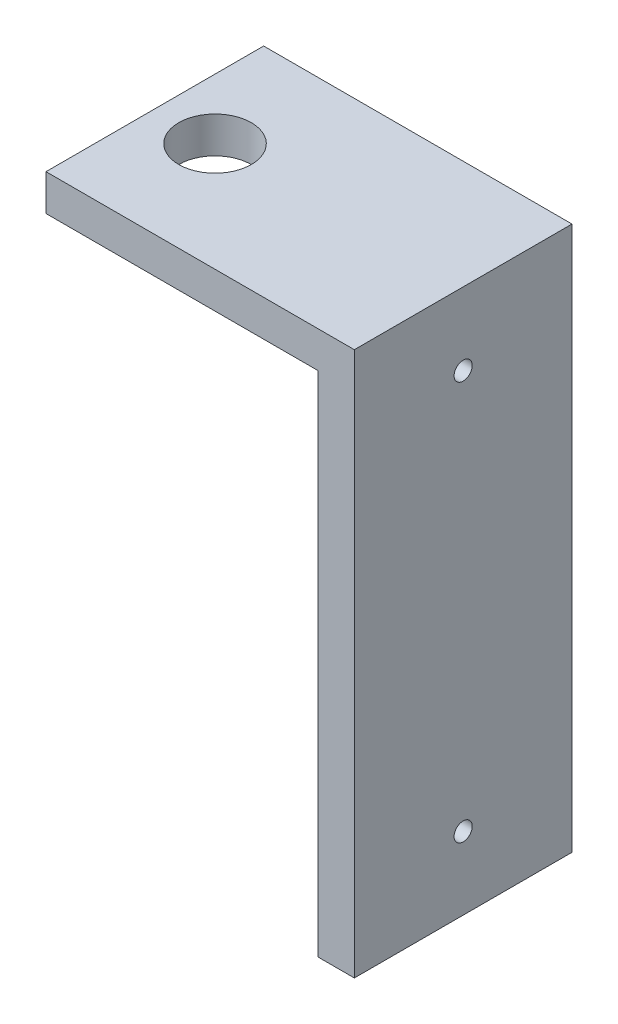
ISO-10303-21;
HEADER;
FILE_DESCRIPTION(('STEP AP214'),'2;1');
FILE_NAME('part.step','',(''),(''),'','','');
FILE_SCHEMA(('AUTOMOTIVE_DESIGN { 1 0 10303 214 1 1 1 1 }'));
ENDSEC;
DATA;
#1=APPLICATION_CONTEXT('core data for automotive mechanical design processes');
#2=APPLICATION_PROTOCOL_DEFINITION('international standard','automotive_design',2000,#1);
#3=PRODUCT_CONTEXT('',#1,'mechanical');
#4=PRODUCT('Part','Part','',(#3));
#5=PRODUCT_RELATED_PRODUCT_CATEGORY('part','',(#4));
#6=PRODUCT_DEFINITION_FORMATION('','',#4);
#7=PRODUCT_DEFINITION_CONTEXT('part definition',#1,'design');
#8=PRODUCT_DEFINITION('design','',#6,#7);
#9=PRODUCT_DEFINITION_SHAPE('','',#8);
#10=(LENGTH_UNIT() NAMED_UNIT(*) SI_UNIT(.MILLI.,.METRE.));
#11=(NAMED_UNIT(*) PLANE_ANGLE_UNIT() SI_UNIT($,.RADIAN.));
#12=(NAMED_UNIT(*) SI_UNIT($,.STERADIAN.) SOLID_ANGLE_UNIT());
#13=UNCERTAINTY_MEASURE_WITH_UNIT(LENGTH_MEASURE(1.E-05),#10,'distance_accuracy_value','');
#14=(GEOMETRIC_REPRESENTATION_CONTEXT(3) GLOBAL_UNCERTAINTY_ASSIGNED_CONTEXT((#13)) GLOBAL_UNIT_ASSIGNED_CONTEXT((#10,
#11,#12)) REPRESENTATION_CONTEXT('',''));
#15=CARTESIAN_POINT('',(0.,0.,0.));
#16=DIRECTION('',(0.,0.,1.));
#17=DIRECTION('',(1.,0.,0.));
#18=AXIS2_PLACEMENT_3D('',#15,#16,#17);
#19=CARTESIAN_POINT('',(8.63397830992589,10.469387755102,6.));
#20=DIRECTION('',(1.,0.,0.));
#21=DIRECTION('',(0.,1.,0.));
#22=AXIS2_PLACEMENT_3D('',#19,#20,#21);
#23=PLANE('',#22);
#24=DIRECTION('',(0.,-1.,0.));
#25=VECTOR('',#24,1.);
#26=CARTESIAN_POINT('',(8.63397830992589,10.469387755102,-6.));
#27=LINE('',#26,#25);
#28=CARTESIAN_POINT('',(8.63397830992589,10.469387755102,-6.));
#29=VERTEX_POINT('',#28);
#30=CARTESIAN_POINT('',(8.6339783099259,8.46938775510203,-6.));
#31=VERTEX_POINT('',#30);
#32=EDGE_CURVE('E117',#29,#31,#27,.T.);
#33=ORIENTED_EDGE('',*,*,#32,.T.);
#34=DIRECTION('',(0.,0.,-1.));
#35=VECTOR('',#34,1.);
#36=CARTESIAN_POINT('',(8.6339783099259,8.46938775510203,6.));
#37=LINE('',#36,#35);
#38=CARTESIAN_POINT('',(8.6339783099259,8.46938775510203,6.));
#39=VERTEX_POINT('',#38);
#40=EDGE_CURVE('E11',#39,#31,#37,.T.);
#41=ORIENTED_EDGE('',*,*,#40,.F.);
#42=DIRECTION('',(0.,-1.,0.));
#43=VECTOR('',#42,1.);
#44=CARTESIAN_POINT('',(8.63397830992589,10.469387755102,6.));
#45=LINE('',#44,#43);
#46=CARTESIAN_POINT('',(8.63397830992589,10.469387755102,6.));
#47=VERTEX_POINT('',#46);
#48=EDGE_CURVE('E128',#47,#39,#45,.T.);
#49=ORIENTED_EDGE('',*,*,#48,.F.);
#50=DIRECTION('',(0.,0.,-1.));
#51=VECTOR('',#50,1.);
#52=CARTESIAN_POINT('',(8.63397830992589,10.469387755102,6.));
#53=LINE('',#52,#51);
#54=EDGE_CURVE('E113',#47,#29,#53,.T.);
#55=ORIENTED_EDGE('',*,*,#54,.T.);
#56=EDGE_LOOP('',(#33,#41,#49,#55));
#57=FACE_BOUND('',#56,.T.);
#58=ADVANCED_FACE('F33',(#57),#23,.F.);
#59=CARTESIAN_POINT('',(8.6339783099259,8.46938775510203,6.));
#60=DIRECTION('',(0.,1.,0.));
#61=DIRECTION('',(0.,0.,1.));
#62=AXIS2_PLACEMENT_3D('',#59,#60,#61);
#63=PLANE('',#62);
#64=CARTESIAN_POINT('',(11.9532168855869,8.46938775510203,0.));
#65=DIRECTION('',(0.,1.,0.));
#66=DIRECTION('',(0.,0.,1.));
#67=AXIS2_PLACEMENT_3D('',#64,#65,#66);
#68=CIRCLE('',#67,2.);
#69=CARTESIAN_POINT('',(11.9532168855869,8.46938775510203,2.));
#70=VERTEX_POINT('',#69);
#71=EDGE_CURVE('E121',#70,#70,#68,.T.);
#72=ORIENTED_EDGE('',*,*,#71,.T.);
#73=EDGE_LOOP('',(#72));
#74=FACE_BOUND('',#73,.T.);
#75=DIRECTION('',(1.,0.,0.));
#76=VECTOR('',#75,1.);
#77=CARTESIAN_POINT('',(8.6339783099259,8.46938775510203,-6.));
#78=LINE('',#77,#76);
#79=CARTESIAN_POINT('',(23.6339783099259,8.46938775510203,-6.));
#80=VERTEX_POINT('',#79);
#81=EDGE_CURVE('E120',#31,#80,#78,.T.);
#82=ORIENTED_EDGE('',*,*,#81,.T.);
#83=DIRECTION('',(0.,0.,-1.));
#84=VECTOR('',#83,1.);
#85=CARTESIAN_POINT('',(23.6339783099259,8.46938775510203,6.));
#86=LINE('',#85,#84);
#87=CARTESIAN_POINT('',(23.6339783099259,8.46938775510203,6.));
#88=VERTEX_POINT('',#87);
#89=EDGE_CURVE('E41',#88,#80,#86,.T.);
#90=ORIENTED_EDGE('',*,*,#89,.F.);
#91=DIRECTION('',(1.,0.,0.));
#92=VECTOR('',#91,1.);
#93=CARTESIAN_POINT('',(8.6339783099259,8.46938775510203,6.));
#94=LINE('',#93,#92);
#95=EDGE_CURVE('E86',#39,#88,#94,.T.);
#96=ORIENTED_EDGE('',*,*,#95,.F.);
#97=ORIENTED_EDGE('',*,*,#40,.T.);
#98=EDGE_LOOP('',(#82,#90,#96,#97));
#99=FACE_BOUND('',#98,.T.);
#100=ADVANCED_FACE('F155',(#74,#99),#63,.F.);
#101=CARTESIAN_POINT('',(23.6339783099259,8.46938775510203,6.));
#102=DIRECTION('',(1.,0.,0.));
#103=DIRECTION('',(0.,1.,0.));
#104=AXIS2_PLACEMENT_3D('',#101,#102,#103);
#105=PLANE('',#104);
#106=CARTESIAN_POINT('',(23.6339783099259,6.46938775510203,0.));
#107=DIRECTION('',(1.,0.,0.));
#108=DIRECTION('',(0.,1.,0.));
#109=AXIS2_PLACEMENT_3D('',#106,#107,#108);
#110=CIRCLE('',#109,0.5);
#111=CARTESIAN_POINT('',(23.6339783099259,6.96938775510203,0.));
#112=VERTEX_POINT('',#111);
#113=EDGE_CURVE('E258',#112,#112,#110,.F.);
#114=ORIENTED_EDGE('',*,*,#113,.F.);
#115=EDGE_LOOP('',(#114));
#116=FACE_BOUND('',#115,.T.);
#117=CARTESIAN_POINT('',(23.6339783099259,-15.530612244898,0.));
#118=DIRECTION('',(1.,0.,0.));
#119=DIRECTION('',(0.,1.,0.));
#120=AXIS2_PLACEMENT_3D('',#117,#118,#119);
#121=CIRCLE('',#120,0.5);
#122=CARTESIAN_POINT('',(23.6339783099259,-15.030612244898,0.));
#123=VERTEX_POINT('',#122);
#124=EDGE_CURVE('E248',#123,#123,#121,.F.);
#125=ORIENTED_EDGE('',*,*,#124,.F.);
#126=EDGE_LOOP('',(#125));
#127=FACE_BOUND('',#126,.T.);
#128=DIRECTION('',(0.,-1.,0.));
#129=VECTOR('',#128,1.);
#130=CARTESIAN_POINT('',(23.6339783099259,8.46938775510203,-6.));
#131=LINE('',#130,#129);
#132=CARTESIAN_POINT('',(23.6339783099259,-19.530612244898,-6.));
#133=VERTEX_POINT('',#132);
#134=EDGE_CURVE('E123',#80,#133,#131,.T.);
#135=ORIENTED_EDGE('',*,*,#134,.T.);
#136=DIRECTION('',(0.,0.,-1.));
#137=VECTOR('',#136,1.);
#138=CARTESIAN_POINT('',(23.6339783099259,-19.530612244898,6.));
#139=LINE('',#138,#137);
#140=CARTESIAN_POINT('',(23.6339783099259,-19.530612244898,6.));
#141=VERTEX_POINT('',#140);
#142=EDGE_CURVE('E108',#141,#133,#139,.T.);
#143=ORIENTED_EDGE('',*,*,#142,.F.);
#144=DIRECTION('',(0.,-1.,0.));
#145=VECTOR('',#144,1.);
#146=CARTESIAN_POINT('',(23.6339783099259,8.46938775510203,6.));
#147=LINE('',#146,#145);
#148=EDGE_CURVE('E99',#88,#141,#147,.T.);
#149=ORIENTED_EDGE('',*,*,#148,.F.);
#150=ORIENTED_EDGE('',*,*,#89,.T.);
#151=EDGE_LOOP('',(#135,#143,#149,#150));
#152=FACE_BOUND('',#151,.T.);
#153=ADVANCED_FACE('F134',(#116,#127,#152),#105,.F.);
#154=CARTESIAN_POINT('',(23.6339783099259,-19.530612244898,6.));
#155=DIRECTION('',(0.,1.,0.));
#156=DIRECTION('',(0.,0.,1.));
#157=AXIS2_PLACEMENT_3D('',#154,#155,#156);
#158=PLANE('',#157);
#159=DIRECTION('',(1.,0.,0.));
#160=VECTOR('',#159,1.);
#161=CARTESIAN_POINT('',(23.6339783099259,-19.530612244898,-6.));
#162=LINE('',#161,#160);
#163=CARTESIAN_POINT('',(25.6339783099259,-19.530612244898,-6.));
#164=VERTEX_POINT('',#163);
#165=EDGE_CURVE('E107',#133,#164,#162,.T.);
#166=ORIENTED_EDGE('',*,*,#165,.T.);
#167=DIRECTION('',(0.,0.,-1.));
#168=VECTOR('',#167,1.);
#169=CARTESIAN_POINT('',(25.6339783099259,-19.530612244898,6.));
#170=LINE('',#169,#168);
#171=CARTESIAN_POINT('',(25.6339783099259,-19.530612244898,6.));
#172=VERTEX_POINT('',#171);
#173=EDGE_CURVE('E104',#172,#164,#170,.T.);
#174=ORIENTED_EDGE('',*,*,#173,.F.);
#175=DIRECTION('',(1.,0.,0.));
#176=VECTOR('',#175,1.);
#177=CARTESIAN_POINT('',(23.6339783099259,-19.530612244898,6.));
#178=LINE('',#177,#176);
#179=EDGE_CURVE('E93',#141,#172,#178,.T.);
#180=ORIENTED_EDGE('',*,*,#179,.F.);
#181=ORIENTED_EDGE('',*,*,#142,.T.);
#182=EDGE_LOOP('',(#166,#174,#180,#181));
#183=FACE_BOUND('',#182,.T.);
#184=ADVANCED_FACE('F105',(#183),#158,.F.);
#185=CARTESIAN_POINT('',(25.6339783099259,-19.530612244898,6.));
#186=DIRECTION('',(-1.,0.,0.));
#187=DIRECTION('',(0.,0.,1.));
#188=AXIS2_PLACEMENT_3D('',#185,#186,#187);
#189=PLANE('',#188);
#190=CARTESIAN_POINT('',(25.6339783099259,6.46938775510203,0.));
#191=DIRECTION('',(1.,0.,0.));
#192=DIRECTION('',(0.,0.,-1.));
#193=AXIS2_PLACEMENT_3D('',#190,#191,#192);
#194=CIRCLE('',#193,0.5);
#195=CARTESIAN_POINT('',(25.6339783099259,6.46938775510203,-0.500000000000001));
#196=VERTEX_POINT('',#195);
#197=EDGE_CURVE('E261',#196,#196,#194,.T.);
#198=ORIENTED_EDGE('',*,*,#197,.F.);
#199=EDGE_LOOP('',(#198));
#200=FACE_BOUND('',#199,.T.);
#201=CARTESIAN_POINT('',(25.6339783099259,-15.530612244898,0.));
#202=DIRECTION('',(1.,0.,0.));
#203=DIRECTION('',(0.,0.,-1.));
#204=AXIS2_PLACEMENT_3D('',#201,#202,#203);
#205=CIRCLE('',#204,0.5);
#206=CARTESIAN_POINT('',(25.6339783099259,-15.530612244898,-0.500000000000004));
#207=VERTEX_POINT('',#206);
#208=EDGE_CURVE('E255',#207,#207,#205,.T.);
#209=ORIENTED_EDGE('',*,*,#208,.F.);
#210=EDGE_LOOP('',(#209));
#211=FACE_BOUND('',#210,.T.);
#212=DIRECTION('',(0.,1.,0.));
#213=VECTOR('',#212,1.);
#214=CARTESIAN_POINT('',(25.6339783099259,-19.530612244898,-6.));
#215=LINE('',#214,#213);
#216=CARTESIAN_POINT('',(25.6339783099259,10.469387755102,-6.));
#217=VERTEX_POINT('',#216);
#218=EDGE_CURVE('E72',#164,#217,#215,.T.);
#219=ORIENTED_EDGE('',*,*,#218,.T.);
#220=DIRECTION('',(0.,0.,-1.));
#221=VECTOR('',#220,1.);
#222=CARTESIAN_POINT('',(25.6339783099259,10.469387755102,6.));
#223=LINE('',#222,#221);
#224=CARTESIAN_POINT('',(25.6339783099259,10.469387755102,6.));
#225=VERTEX_POINT('',#224);
#226=EDGE_CURVE('E109',#225,#217,#223,.T.);
#227=ORIENTED_EDGE('',*,*,#226,.F.);
#228=DIRECTION('',(0.,1.,0.));
#229=VECTOR('',#228,1.);
#230=CARTESIAN_POINT('',(25.6339783099259,-19.530612244898,6.));
#231=LINE('',#230,#229);
#232=EDGE_CURVE('E97',#172,#225,#231,.T.);
#233=ORIENTED_EDGE('',*,*,#232,.F.);
#234=ORIENTED_EDGE('',*,*,#173,.T.);
#235=EDGE_LOOP('',(#219,#227,#233,#234));
#236=FACE_BOUND('',#235,.T.);
#237=ADVANCED_FACE('F111',(#200,#211,#236),#189,.F.);
#238=CARTESIAN_POINT('',(25.6339783099259,10.469387755102,6.));
#239=DIRECTION('',(0.,-1.,0.));
#240=DIRECTION('',(1.,0.,0.));
#241=AXIS2_PLACEMENT_3D('',#238,#239,#240);
#242=PLANE('',#241);
#243=CARTESIAN_POINT('',(11.9532168855869,10.469387755102,0.));
#244=DIRECTION('',(0.,1.,0.));
#245=DIRECTION('',(-1.,0.,0.));
#246=AXIS2_PLACEMENT_3D('',#243,#244,#245);
#247=CIRCLE('',#246,2.);
#248=CARTESIAN_POINT('',(9.95321688558692,10.469387755102,0.));
#249=VERTEX_POINT('',#248);
#250=EDGE_CURVE('E245',#249,#249,#247,.T.);
#251=ORIENTED_EDGE('',*,*,#250,.F.);
#252=EDGE_LOOP('',(#251));
#253=FACE_BOUND('',#252,.T.);
#254=DIRECTION('',(-1.,0.,0.));
#255=VECTOR('',#254,1.);
#256=CARTESIAN_POINT('',(25.6339783099259,10.469387755102,-6.));
#257=LINE('',#256,#255);
#258=EDGE_CURVE('E78',#217,#29,#257,.T.);
#259=ORIENTED_EDGE('',*,*,#258,.T.);
#260=ORIENTED_EDGE('',*,*,#54,.F.);
#261=DIRECTION('',(-1.,0.,0.));
#262=VECTOR('',#261,1.);
#263=CARTESIAN_POINT('',(25.6339783099259,10.469387755102,6.));
#264=LINE('',#263,#262);
#265=EDGE_CURVE('E49',#225,#47,#264,.T.);
#266=ORIENTED_EDGE('',*,*,#265,.F.);
#267=ORIENTED_EDGE('',*,*,#226,.T.);
#268=EDGE_LOOP('',(#259,#260,#266,#267));
#269=FACE_BOUND('',#268,.T.);
#270=ADVANCED_FACE('F141',(#253,#269),#242,.F.);
#271=CARTESIAN_POINT('',(0.,0.,6.));
#272=DIRECTION('',(0.,0.,1.));
#273=DIRECTION('',(1.,0.,0.));
#274=AXIS2_PLACEMENT_3D('',#271,#272,#273);
#275=PLANE('',#274);
#276=ORIENTED_EDGE('',*,*,#48,.T.);
#277=ORIENTED_EDGE('',*,*,#95,.T.);
#278=ORIENTED_EDGE('',*,*,#148,.T.);
#279=ORIENTED_EDGE('',*,*,#179,.T.);
#280=ORIENTED_EDGE('',*,*,#232,.T.);
#281=ORIENTED_EDGE('',*,*,#265,.T.);
#282=EDGE_LOOP('',(#276,#277,#278,#279,#280,#281));
#283=FACE_BOUND('',#282,.T.);
#284=ADVANCED_FACE('F95',(#283),#275,.T.);
#285=CARTESIAN_POINT('',(0.,0.,-6.));
#286=DIRECTION('',(0.,0.,1.));
#287=DIRECTION('',(1.,0.,0.));
#288=AXIS2_PLACEMENT_3D('',#285,#286,#287);
#289=PLANE('',#288);
#290=ORIENTED_EDGE('',*,*,#32,.F.);
#291=ORIENTED_EDGE('',*,*,#258,.F.);
#292=ORIENTED_EDGE('',*,*,#218,.F.);
#293=ORIENTED_EDGE('',*,*,#165,.F.);
#294=ORIENTED_EDGE('',*,*,#134,.F.);
#295=ORIENTED_EDGE('',*,*,#81,.F.);
#296=EDGE_LOOP('',(#290,#291,#292,#293,#294,#295));
#297=FACE_BOUND('',#296,.T.);
#298=ADVANCED_FACE('F137',(#297),#289,.F.);
#299=CARTESIAN_POINT('',(11.9532168855869,0.469387755102031,0.));
#300=DIRECTION('',(0.,1.,0.));
#301=DIRECTION('',(-1.,0.,0.));
#302=AXIS2_PLACEMENT_3D('',#299,#300,#301);
#303=CYLINDRICAL_SURFACE('',#302,2.);
#304=ORIENTED_EDGE('',*,*,#250,.T.);
#305=EDGE_LOOP('',(#304));
#306=FACE_BOUND('',#305,.T.);
#307=ORIENTED_EDGE('',*,*,#71,.F.);
#308=EDGE_LOOP('',(#307));
#309=FACE_BOUND('',#308,.T.);
#310=ADVANCED_FACE('F192',(#306,#309),#303,.F.);
#311=CARTESIAN_POINT('',(8.6329783099259,-15.530612244898,0.));
#312=DIRECTION('',(1.,0.,0.));
#313=DIRECTION('',(0.,0.,-1.));
#314=AXIS2_PLACEMENT_3D('',#311,#312,#313);
#315=CYLINDRICAL_SURFACE('',#314,0.5);
#316=ORIENTED_EDGE('',*,*,#208,.T.);
#317=EDGE_LOOP('',(#316));
#318=FACE_BOUND('',#317,.T.);
#319=ORIENTED_EDGE('',*,*,#124,.T.);
#320=EDGE_LOOP('',(#319));
#321=FACE_BOUND('',#320,.T.);
#322=ADVANCED_FACE('F186',(#318,#321),#315,.F.);
#323=CARTESIAN_POINT('',(8.6329783099259,6.46938775510203,0.));
#324=DIRECTION('',(1.,0.,0.));
#325=DIRECTION('',(0.,0.,-1.));
#326=AXIS2_PLACEMENT_3D('',#323,#324,#325);
#327=CYLINDRICAL_SURFACE('',#326,0.5);
#328=ORIENTED_EDGE('',*,*,#197,.T.);
#329=EDGE_LOOP('',(#328));
#330=FACE_BOUND('',#329,.T.);
#331=ORIENTED_EDGE('',*,*,#113,.T.);
#332=EDGE_LOOP('',(#331));
#333=FACE_BOUND('',#332,.T.);
#334=ADVANCED_FACE('F191',(#330,#333),#327,.F.);
#335=CLOSED_SHELL('',(#58,#100,#153,#184,#237,#270,#284,#298,#310,#322,#334));
#336=MANIFOLD_SOLID_BREP('B2',#335);
#337=ADVANCED_BREP_SHAPE_REPRESENTATION('',(#18,#336),#14);
#338=SHAPE_DEFINITION_REPRESENTATION(#9,#337);
ENDSEC;
END-ISO-10303-21;
